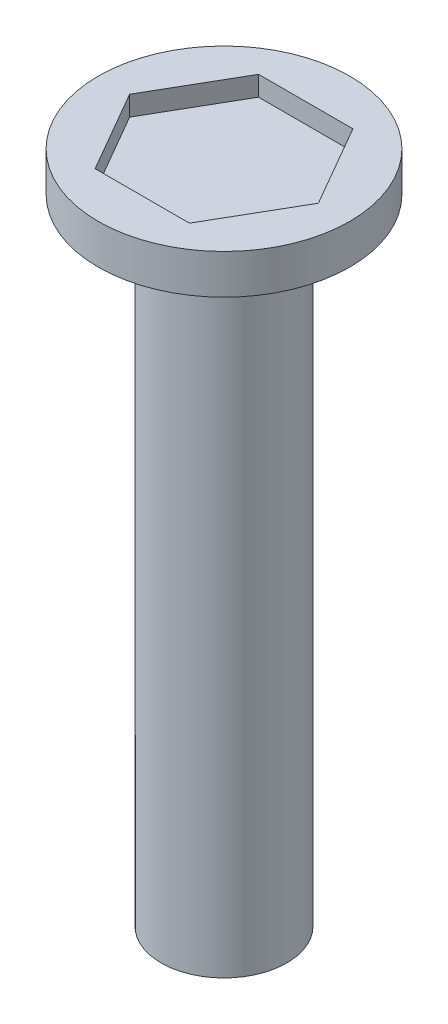
ISO-10303-21;
HEADER;
FILE_DESCRIPTION(('STEP AP214'),'2;1');
FILE_NAME('part.step','',(''),(''),'','','');
FILE_SCHEMA(('AUTOMOTIVE_DESIGN { 1 0 10303 214 1 1 1 1 }'));
ENDSEC;
DATA;
#1=APPLICATION_CONTEXT('core data for automotive mechanical design processes');
#2=APPLICATION_PROTOCOL_DEFINITION('international standard','automotive_design',2000,#1);
#3=PRODUCT_CONTEXT('',#1,'mechanical');
#4=PRODUCT('Part','Part','',(#3));
#5=PRODUCT_RELATED_PRODUCT_CATEGORY('part','',(#4));
#6=PRODUCT_DEFINITION_FORMATION('','',#4);
#7=PRODUCT_DEFINITION_CONTEXT('part definition',#1,'design');
#8=PRODUCT_DEFINITION('design','',#6,#7);
#9=PRODUCT_DEFINITION_SHAPE('','',#8);
#10=(LENGTH_UNIT() NAMED_UNIT(*) SI_UNIT(.MILLI.,.METRE.));
#11=(NAMED_UNIT(*) PLANE_ANGLE_UNIT() SI_UNIT($,.RADIAN.));
#12=(NAMED_UNIT(*) SI_UNIT($,.STERADIAN.) SOLID_ANGLE_UNIT());
#13=UNCERTAINTY_MEASURE_WITH_UNIT(LENGTH_MEASURE(1.E-05),#10,'distance_accuracy_value','');
#14=(GEOMETRIC_REPRESENTATION_CONTEXT(3) GLOBAL_UNCERTAINTY_ASSIGNED_CONTEXT((#13)) GLOBAL_UNIT_ASSIGNED_CONTEXT((#10,
#11,#12)) REPRESENTATION_CONTEXT('',''));
#15=CARTESIAN_POINT('',(0.,0.,0.));
#16=DIRECTION('',(0.,0.,1.));
#17=DIRECTION('',(1.,0.,0.));
#18=AXIS2_PLACEMENT_3D('',#15,#16,#17);
#19=CARTESIAN_POINT('',(3.175,0.,0.));
#20=DIRECTION('',(0.,1.,0.));
#21=DIRECTION('',(-1.,0.,0.));
#22=AXIS2_PLACEMENT_3D('',#19,#20,#21);
#23=CYLINDRICAL_SURFACE('',#22,3.175);
#24=CARTESIAN_POINT('',(3.175,-1.,0.));
#25=DIRECTION('',(0.,1.,0.));
#26=DIRECTION('',(-1.,0.,0.));
#27=AXIS2_PLACEMENT_3D('',#24,#25,#26);
#28=CIRCLE('',#27,3.175);
#29=CARTESIAN_POINT('',(0.,-1.,0.));
#30=VERTEX_POINT('',#29);
#31=EDGE_CURVE('E133',#30,#30,#28,.T.);
#32=ORIENTED_EDGE('',*,*,#31,.T.);
#33=EDGE_LOOP('',(#32));
#34=FACE_BOUND('',#33,.T.);
#35=CARTESIAN_POINT('',(3.175,0.,0.));
#36=DIRECTION('',(0.,1.,0.));
#37=DIRECTION('',(-1.,0.,0.));
#38=AXIS2_PLACEMENT_3D('',#35,#36,#37);
#39=CIRCLE('',#38,3.175);
#40=CARTESIAN_POINT('',(0.,0.,0.));
#41=VERTEX_POINT('',#40);
#42=EDGE_CURVE('E11',#41,#41,#39,.T.);
#43=ORIENTED_EDGE('',*,*,#42,.F.);
#44=EDGE_LOOP('',(#43));
#45=FACE_BOUND('',#44,.T.);
#46=ADVANCED_FACE('F32',(#34,#45),#23,.T.);
#47=CARTESIAN_POINT('',(0.,0.,0.));
#48=DIRECTION('',(0.,1.,0.));
#49=DIRECTION('',(-1.,0.,0.));
#50=AXIS2_PLACEMENT_3D('',#47,#48,#49);
#51=PLANE('',#50);
#52=DIRECTION('',(0.5,0.,-0.866025403784439));
#53=VECTOR('',#52,1.);
#54=CARTESIAN_POINT('',(4.365625,0.,2.06222299276169));
#55=LINE('',#54,#53);
#56=CARTESIAN_POINT('',(4.365625,0.,2.06222299276169));
#57=VERTEX_POINT('',#56);
#58=CARTESIAN_POINT('',(5.55625,0.,0.));
#59=VERTEX_POINT('',#58);
#60=EDGE_CURVE('E46',#57,#59,#55,.T.);
#61=ORIENTED_EDGE('',*,*,#60,.F.);
#62=DIRECTION('',(1.,0.,0.));
#63=VECTOR('',#62,1.);
#64=CARTESIAN_POINT('',(1.984375,0.,2.06222299276169));
#65=LINE('',#64,#63);
#66=CARTESIAN_POINT('',(1.984375,0.,2.06222299276169));
#67=VERTEX_POINT('',#66);
#68=EDGE_CURVE('E129',#67,#57,#65,.T.);
#69=ORIENTED_EDGE('',*,*,#68,.F.);
#70=DIRECTION('',(0.5,0.,0.866025403784438));
#71=VECTOR('',#70,1.);
#72=CARTESIAN_POINT('',(0.793749999999999,0.,0.));
#73=LINE('',#72,#71);
#74=CARTESIAN_POINT('',(0.793749999999999,0.,0.));
#75=VERTEX_POINT('',#74);
#76=EDGE_CURVE('E127',#75,#67,#73,.T.);
#77=ORIENTED_EDGE('',*,*,#76,.F.);
#78=DIRECTION('',(-0.5,0.,0.866025403784439));
#79=VECTOR('',#78,1.);
#80=CARTESIAN_POINT('',(1.984375,0.,-2.0622229927617));
#81=LINE('',#80,#79);
#82=CARTESIAN_POINT('',(1.984375,0.,-2.0622229927617));
#83=VERTEX_POINT('',#82);
#84=EDGE_CURVE('E94',#83,#75,#81,.T.);
#85=ORIENTED_EDGE('',*,*,#84,.F.);
#86=DIRECTION('',(-1.,0.,0.));
#87=VECTOR('',#86,1.);
#88=CARTESIAN_POINT('',(4.365625,0.,-2.0622229927617));
#89=LINE('',#88,#87);
#90=CARTESIAN_POINT('',(4.365625,0.,-2.0622229927617));
#91=VERTEX_POINT('',#90);
#92=EDGE_CURVE('E123',#91,#83,#89,.T.);
#93=ORIENTED_EDGE('',*,*,#92,.F.);
#94=DIRECTION('',(-0.5,0.,-0.866025403784439));
#95=VECTOR('',#94,1.);
#96=CARTESIAN_POINT('',(5.55625,0.,0.));
#97=LINE('',#96,#95);
#98=EDGE_CURVE('E120',#59,#91,#97,.T.);
#99=ORIENTED_EDGE('',*,*,#98,.F.);
#100=EDGE_LOOP('',(#61,#69,#77,#85,#93,#99));
#101=FACE_BOUND('',#100,.T.);
#102=ORIENTED_EDGE('',*,*,#42,.T.);
#103=EDGE_LOOP('',(#102));
#104=FACE_BOUND('',#103,.T.);
#105=ADVANCED_FACE('F151',(#101,#104),#51,.T.);
#106=CARTESIAN_POINT('',(3.175,-17.,0.));
#107=DIRECTION('',(0.,-1.,0.));
#108=DIRECTION('',(1.,0.,0.));
#109=AXIS2_PLACEMENT_3D('',#106,#107,#108);
#110=PLANE('',#109);
#111=CARTESIAN_POINT('',(3.175,-17.,0.));
#112=DIRECTION('',(0.,1.,0.));
#113=DIRECTION('',(-1.,0.,0.));
#114=AXIS2_PLACEMENT_3D('',#111,#112,#113);
#115=CIRCLE('',#114,1.5875);
#116=CARTESIAN_POINT('',(1.5875,-17.,0.));
#117=VERTEX_POINT('',#116);
#118=EDGE_CURVE('E39',#117,#117,#115,.T.);
#119=ORIENTED_EDGE('',*,*,#118,.F.);
#120=EDGE_LOOP('',(#119));
#121=FACE_BOUND('',#120,.T.);
#122=ADVANCED_FACE('F149',(#121),#110,.T.);
#123=CARTESIAN_POINT('',(3.175,0.,0.));
#124=DIRECTION('',(0.,1.,0.));
#125=DIRECTION('',(-1.,0.,0.));
#126=AXIS2_PLACEMENT_3D('',#123,#124,#125);
#127=CYLINDRICAL_SURFACE('',#126,1.5875);
#128=ORIENTED_EDGE('',*,*,#118,.T.);
#129=EDGE_LOOP('',(#128));
#130=FACE_BOUND('',#129,.T.);
#131=CARTESIAN_POINT('',(3.175,-1.,0.));
#132=DIRECTION('',(0.,1.,0.));
#133=DIRECTION('',(-1.,0.,0.));
#134=AXIS2_PLACEMENT_3D('',#131,#132,#133);
#135=CIRCLE('',#134,1.5875);
#136=CARTESIAN_POINT('',(1.5875,-1.,0.));
#137=VERTEX_POINT('',#136);
#138=EDGE_CURVE('E141',#137,#137,#135,.T.);
#139=ORIENTED_EDGE('',*,*,#138,.F.);
#140=EDGE_LOOP('',(#139));
#141=FACE_BOUND('',#140,.T.);
#142=ADVANCED_FACE('F146',(#130,#141),#127,.T.);
#143=CARTESIAN_POINT('',(1.5875,-1.,0.));
#144=DIRECTION('',(0.,-1.,0.));
#145=DIRECTION('',(1.,0.,0.));
#146=AXIS2_PLACEMENT_3D('',#143,#144,#145);
#147=PLANE('',#146);
#148=ORIENTED_EDGE('',*,*,#138,.T.);
#149=EDGE_LOOP('',(#148));
#150=FACE_BOUND('',#149,.T.);
#151=ORIENTED_EDGE('',*,*,#31,.F.);
#152=EDGE_LOOP('',(#151));
#153=FACE_BOUND('',#152,.T.);
#154=ADVANCED_FACE('F157',(#150,#153),#147,.T.);
#155=CARTESIAN_POINT('',(4.365625,-0.499999999999999,2.06222299276169));
#156=DIRECTION('',(0.866025403784439,0.,0.5));
#157=DIRECTION('',(0.5,0.,-0.866025403784439));
#158=AXIS2_PLACEMENT_3D('',#155,#156,#157);
#159=PLANE('',#158);
#160=ORIENTED_EDGE('',*,*,#60,.T.);
#161=DIRECTION('',(0.,1.,0.));
#162=VECTOR('',#161,1.);
#163=CARTESIAN_POINT('',(5.55625,-0.499999999999999,0.));
#164=LINE('',#163,#162);
#165=CARTESIAN_POINT('',(5.55625,-0.499999999999999,0.));
#166=VERTEX_POINT('',#165);
#167=EDGE_CURVE('E76',#166,#59,#164,.T.);
#168=ORIENTED_EDGE('',*,*,#167,.F.);
#169=DIRECTION('',(0.5,0.,-0.866025403784439));
#170=VECTOR('',#169,1.);
#171=CARTESIAN_POINT('',(4.365625,-0.499999999999999,2.06222299276169));
#172=LINE('',#171,#170);
#173=CARTESIAN_POINT('',(4.365625,-0.499999999999999,2.06222299276169));
#174=VERTEX_POINT('',#173);
#175=EDGE_CURVE('E131',#174,#166,#172,.T.);
#176=ORIENTED_EDGE('',*,*,#175,.F.);
#177=DIRECTION('',(0.,1.,0.));
#178=VECTOR('',#177,1.);
#179=CARTESIAN_POINT('',(4.365625,-0.499999999999999,2.06222299276169));
#180=LINE('',#179,#178);
#181=EDGE_CURVE('E54',#174,#57,#180,.T.);
#182=ORIENTED_EDGE('',*,*,#181,.T.);
#183=EDGE_LOOP('',(#160,#168,#176,#182));
#184=FACE_BOUND('',#183,.T.);
#185=ADVANCED_FACE('F170',(#184),#159,.F.);
#186=CARTESIAN_POINT('',(1.984375,-0.5,2.06222299276169));
#187=DIRECTION('',(0.,0.,1.));
#188=DIRECTION('',(1.,0.,0.));
#189=AXIS2_PLACEMENT_3D('',#186,#187,#188);
#190=PLANE('',#189);
#191=ORIENTED_EDGE('',*,*,#68,.T.);
#192=ORIENTED_EDGE('',*,*,#181,.F.);
#193=DIRECTION('',(1.,0.,0.));
#194=VECTOR('',#193,1.);
#195=CARTESIAN_POINT('',(1.984375,-0.5,2.06222299276169));
#196=LINE('',#195,#194);
#197=CARTESIAN_POINT('',(1.984375,-0.5,2.06222299276169));
#198=VERTEX_POINT('',#197);
#199=EDGE_CURVE('E106',#198,#174,#196,.T.);
#200=ORIENTED_EDGE('',*,*,#199,.F.);
#201=DIRECTION('',(0.,1.,0.));
#202=VECTOR('',#201,1.);
#203=CARTESIAN_POINT('',(1.984375,-0.5,2.06222299276169));
#204=LINE('',#203,#202);
#205=EDGE_CURVE('E98',#198,#67,#204,.T.);
#206=ORIENTED_EDGE('',*,*,#205,.T.);
#207=EDGE_LOOP('',(#191,#192,#200,#206));
#208=FACE_BOUND('',#207,.T.);
#209=ADVANCED_FACE('F176',(#208),#190,.F.);
#210=CARTESIAN_POINT('',(0.79375,-0.5,0.));
#211=DIRECTION('',(-0.866025403784438,0.,0.5));
#212=DIRECTION('',(0.5,0.,0.866025403784439));
#213=AXIS2_PLACEMENT_3D('',#210,#211,#212);
#214=PLANE('',#213);
#215=ORIENTED_EDGE('',*,*,#76,.T.);
#216=ORIENTED_EDGE('',*,*,#205,.F.);
#217=DIRECTION('',(0.5,0.,0.866025403784438));
#218=VECTOR('',#217,1.);
#219=CARTESIAN_POINT('',(0.79375,-0.5,0.));
#220=LINE('',#219,#218);
#221=CARTESIAN_POINT('',(0.79375,-0.5,0.));
#222=VERTEX_POINT('',#221);
#223=EDGE_CURVE('E102',#222,#198,#220,.T.);
#224=ORIENTED_EDGE('',*,*,#223,.F.);
#225=DIRECTION('',(0.,1.,0.));
#226=VECTOR('',#225,1.);
#227=CARTESIAN_POINT('',(0.79375,-0.5,0.));
#228=LINE('',#227,#226);
#229=EDGE_CURVE('E87',#222,#75,#228,.T.);
#230=ORIENTED_EDGE('',*,*,#229,.T.);
#231=EDGE_LOOP('',(#215,#216,#224,#230));
#232=FACE_BOUND('',#231,.T.);
#233=ADVANCED_FACE('F103',(#232),#214,.F.);
#234=CARTESIAN_POINT('',(1.984375,-0.5,-2.0622229927617));
#235=DIRECTION('',(-0.866025403784439,0.,-0.5));
#236=DIRECTION('',(-0.5,0.,0.866025403784439));
#237=AXIS2_PLACEMENT_3D('',#234,#235,#236);
#238=PLANE('',#237);
#239=ORIENTED_EDGE('',*,*,#84,.T.);
#240=ORIENTED_EDGE('',*,*,#229,.F.);
#241=DIRECTION('',(-0.5,0.,0.866025403784439));
#242=VECTOR('',#241,1.);
#243=CARTESIAN_POINT('',(1.984375,-0.5,-2.0622229927617));
#244=LINE('',#243,#242);
#245=CARTESIAN_POINT('',(1.984375,-0.5,-2.0622229927617));
#246=VERTEX_POINT('',#245);
#247=EDGE_CURVE('E91',#246,#222,#244,.T.);
#248=ORIENTED_EDGE('',*,*,#247,.F.);
#249=DIRECTION('',(0.,1.,0.));
#250=VECTOR('',#249,1.);
#251=CARTESIAN_POINT('',(1.984375,-0.5,-2.0622229927617));
#252=LINE('',#251,#250);
#253=EDGE_CURVE('E99',#246,#83,#252,.T.);
#254=ORIENTED_EDGE('',*,*,#253,.T.);
#255=EDGE_LOOP('',(#239,#240,#248,#254));
#256=FACE_BOUND('',#255,.T.);
#257=ADVANCED_FACE('F89',(#256),#238,.F.);
#258=CARTESIAN_POINT('',(4.365625,-0.499999999999999,-2.0622229927617));
#259=DIRECTION('',(0.,0.,-1.));
#260=DIRECTION('',(-1.,0.,0.));
#261=AXIS2_PLACEMENT_3D('',#258,#259,#260);
#262=PLANE('',#261);
#263=ORIENTED_EDGE('',*,*,#92,.T.);
#264=ORIENTED_EDGE('',*,*,#253,.F.);
#265=DIRECTION('',(-1.,0.,0.));
#266=VECTOR('',#265,1.);
#267=CARTESIAN_POINT('',(4.365625,-0.499999999999999,-2.0622229927617));
#268=LINE('',#267,#266);
#269=CARTESIAN_POINT('',(4.365625,-0.499999999999999,-2.0622229927617));
#270=VERTEX_POINT('',#269);
#271=EDGE_CURVE('E112',#270,#246,#268,.T.);
#272=ORIENTED_EDGE('',*,*,#271,.F.);
#273=DIRECTION('',(0.,1.,0.));
#274=VECTOR('',#273,1.);
#275=CARTESIAN_POINT('',(4.365625,-0.499999999999999,-2.0622229927617));
#276=LINE('',#275,#274);
#277=EDGE_CURVE('E136',#270,#91,#276,.T.);
#278=ORIENTED_EDGE('',*,*,#277,.T.);
#279=EDGE_LOOP('',(#263,#264,#272,#278));
#280=FACE_BOUND('',#279,.T.);
#281=ADVANCED_FACE('F182',(#280),#262,.F.);
#282=CARTESIAN_POINT('',(5.55625,-0.499999999999999,0.));
#283=DIRECTION('',(0.866025403784439,0.,-0.5));
#284=DIRECTION('',(-0.5,0.,-0.866025403784439));
#285=AXIS2_PLACEMENT_3D('',#282,#283,#284);
#286=PLANE('',#285);
#287=ORIENTED_EDGE('',*,*,#98,.T.);
#288=ORIENTED_EDGE('',*,*,#277,.F.);
#289=DIRECTION('',(-0.5,0.,-0.866025403784439));
#290=VECTOR('',#289,1.);
#291=CARTESIAN_POINT('',(5.55625,-0.499999999999999,0.));
#292=LINE('',#291,#290);
#293=EDGE_CURVE('E114',#166,#270,#292,.T.);
#294=ORIENTED_EDGE('',*,*,#293,.F.);
#295=ORIENTED_EDGE('',*,*,#167,.T.);
#296=EDGE_LOOP('',(#287,#288,#294,#295));
#297=FACE_BOUND('',#296,.T.);
#298=ADVANCED_FACE('F179',(#297),#286,.F.);
#299=CARTESIAN_POINT('',(0.,-0.5,0.));
#300=DIRECTION('',(0.,1.,0.));
#301=DIRECTION('',(-1.,0.,0.));
#302=AXIS2_PLACEMENT_3D('',#299,#300,#301);
#303=PLANE('',#302);
#304=ORIENTED_EDGE('',*,*,#175,.T.);
#305=ORIENTED_EDGE('',*,*,#293,.T.);
#306=ORIENTED_EDGE('',*,*,#271,.T.);
#307=ORIENTED_EDGE('',*,*,#247,.T.);
#308=ORIENTED_EDGE('',*,*,#223,.T.);
#309=ORIENTED_EDGE('',*,*,#199,.T.);
#310=EDGE_LOOP('',(#304,#305,#306,#307,#308,#309));
#311=FACE_BOUND('',#310,.T.);
#312=ADVANCED_FACE('F109',(#311),#303,.T.);
#313=CLOSED_SHELL('',(#46,#105,#122,#142,#154,#185,#209,#233,#257,#281,#298,#312));
#314=MANIFOLD_SOLID_BREP('B2',#313);
#315=ADVANCED_BREP_SHAPE_REPRESENTATION('',(#18,#314),#14);
#316=SHAPE_DEFINITION_REPRESENTATION(#9,#315);
ENDSEC;
END-ISO-10303-21;
